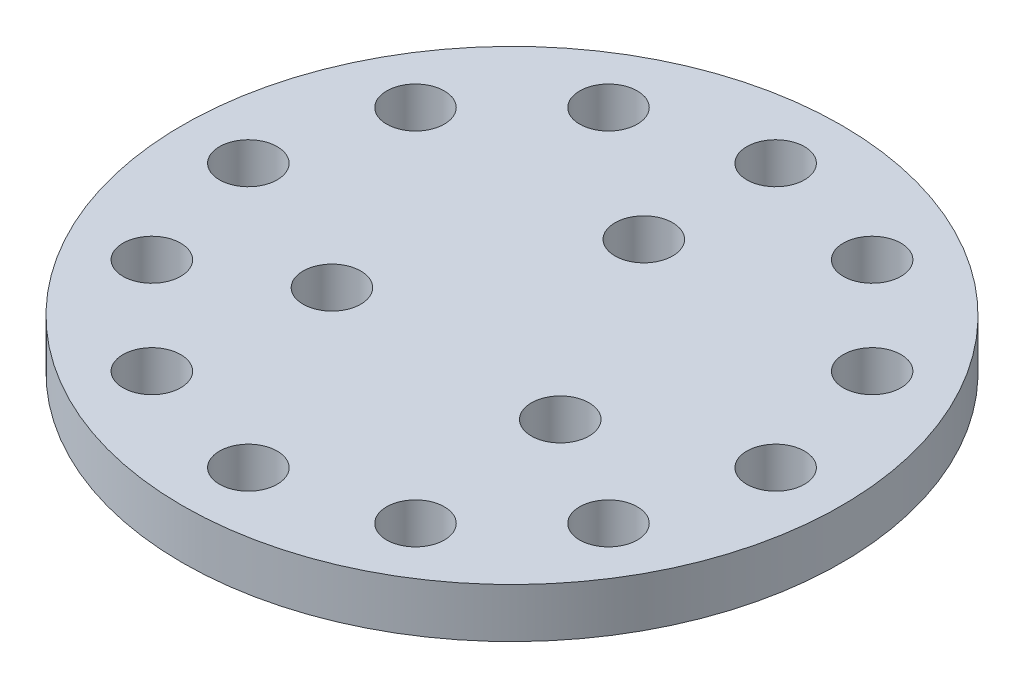
ISO-10303-21;
HEADER;
FILE_DESCRIPTION(('STEP AP214'),'2;1');
FILE_NAME('part.step','',(''),(''),'','','');
FILE_SCHEMA(('AUTOMOTIVE_DESIGN { 1 0 10303 214 1 1 1 1 }'));
ENDSEC;
DATA;
#1=APPLICATION_CONTEXT('core data for automotive mechanical design processes');
#2=APPLICATION_PROTOCOL_DEFINITION('international standard','automotive_design',2000,#1);
#3=PRODUCT_CONTEXT('',#1,'mechanical');
#4=PRODUCT('Part','Part','',(#3));
#5=PRODUCT_RELATED_PRODUCT_CATEGORY('part','',(#4));
#6=PRODUCT_DEFINITION_FORMATION('','',#4);
#7=PRODUCT_DEFINITION_CONTEXT('part definition',#1,'design');
#8=PRODUCT_DEFINITION('design','',#6,#7);
#9=PRODUCT_DEFINITION_SHAPE('','',#8);
#10=(LENGTH_UNIT() NAMED_UNIT(*) SI_UNIT(.MILLI.,.METRE.));
#11=(NAMED_UNIT(*) PLANE_ANGLE_UNIT() SI_UNIT($,.RADIAN.));
#12=(NAMED_UNIT(*) SI_UNIT($,.STERADIAN.) SOLID_ANGLE_UNIT());
#13=UNCERTAINTY_MEASURE_WITH_UNIT(LENGTH_MEASURE(1.E-05),#10,'distance_accuracy_value','');
#14=(GEOMETRIC_REPRESENTATION_CONTEXT(3) GLOBAL_UNCERTAINTY_ASSIGNED_CONTEXT((#13)) GLOBAL_UNIT_ASSIGNED_CONTEXT((#10,
#11,#12)) REPRESENTATION_CONTEXT('',''));
#15=CARTESIAN_POINT('',(0.,0.,0.));
#16=DIRECTION('',(0.,0.,1.));
#17=DIRECTION('',(1.,0.,0.));
#18=AXIS2_PLACEMENT_3D('',#15,#16,#17);
#19=CARTESIAN_POINT('',(0.,3.,0.));
#20=DIRECTION('',(0.,1.,0.));
#21=DIRECTION('',(0.,0.,1.));
#22=AXIS2_PLACEMENT_3D('',#19,#20,#21);
#23=PLANE('',#22);
#24=CARTESIAN_POINT('',(0.,3.,-16.));
#25=DIRECTION('',(0.,1.,0.));
#26=DIRECTION('',(0.,0.,1.));
#27=AXIS2_PLACEMENT_3D('',#24,#25,#26);
#28=CIRCLE('',#27,1.75);
#29=CARTESIAN_POINT('',(0.,3.,-14.25));
#30=VERTEX_POINT('',#29);
#31=EDGE_CURVE('E156',#30,#30,#28,.T.);
#32=ORIENTED_EDGE('',*,*,#31,.F.);
#33=EDGE_LOOP('',(#32));
#34=FACE_BOUND('',#33,.T.);
#35=CARTESIAN_POINT('',(13.856406460551,3.,-8.00000000000002));
#36=DIRECTION('',(0.,1.,0.));
#37=DIRECTION('',(0.,0.,1.));
#38=AXIS2_PLACEMENT_3D('',#35,#36,#37);
#39=CIRCLE('',#38,1.75);
#40=CARTESIAN_POINT('',(13.856406460551,3.,-6.25000000000002));
#41=VERTEX_POINT('',#40);
#42=EDGE_CURVE('E140',#41,#41,#39,.T.);
#43=ORIENTED_EDGE('',*,*,#42,.F.);
#44=EDGE_LOOP('',(#43));
#45=FACE_BOUND('',#44,.T.);
#46=CARTESIAN_POINT('',(13.856406460551,3.,8.00000000000002));
#47=DIRECTION('',(0.,1.,0.));
#48=DIRECTION('',(0.,0.,1.));
#49=AXIS2_PLACEMENT_3D('',#46,#47,#48);
#50=CIRCLE('',#49,1.75);
#51=CARTESIAN_POINT('',(13.856406460551,3.,9.75000000000002));
#52=VERTEX_POINT('',#51);
#53=EDGE_CURVE('E124',#52,#52,#50,.T.);
#54=ORIENTED_EDGE('',*,*,#53,.F.);
#55=EDGE_LOOP('',(#54));
#56=FACE_BOUND('',#55,.T.);
#57=CARTESIAN_POINT('',(7.99999999999997,3.,13.856406460551));
#58=DIRECTION('',(0.,1.,0.));
#59=DIRECTION('',(0.,0.,1.));
#60=AXIS2_PLACEMENT_3D('',#57,#58,#59);
#61=CIRCLE('',#60,1.75);
#62=CARTESIAN_POINT('',(7.99999999999997,3.,15.606406460551));
#63=VERTEX_POINT('',#62);
#64=EDGE_CURVE('E108',#63,#63,#61,.T.);
#65=ORIENTED_EDGE('',*,*,#64,.F.);
#66=EDGE_LOOP('',(#65));
#67=FACE_BOUND('',#66,.T.);
#68=CARTESIAN_POINT('',(-13.8564064605511,3.,7.99999999999992));
#69=DIRECTION('',(0.,1.,0.));
#70=DIRECTION('',(0.,0.,1.));
#71=AXIS2_PLACEMENT_3D('',#68,#69,#70);
#72=CIRCLE('',#71,1.75);
#73=CARTESIAN_POINT('',(-13.8564064605511,3.,9.74999999999992));
#74=VERTEX_POINT('',#73);
#75=EDGE_CURVE('E92',#74,#74,#72,.T.);
#76=ORIENTED_EDGE('',*,*,#75,.F.);
#77=EDGE_LOOP('',(#76));
#78=FACE_BOUND('',#77,.T.);
#79=CARTESIAN_POINT('',(-13.8564064605511,3.,-7.99999999999991));
#80=DIRECTION('',(0.,1.,0.));
#81=DIRECTION('',(0.,0.,1.));
#82=AXIS2_PLACEMENT_3D('',#79,#80,#81);
#83=CIRCLE('',#82,1.75);
#84=CARTESIAN_POINT('',(-13.8564064605511,3.,-6.24999999999992));
#85=VERTEX_POINT('',#84);
#86=EDGE_CURVE('E76',#85,#85,#83,.T.);
#87=ORIENTED_EDGE('',*,*,#86,.F.);
#88=EDGE_LOOP('',(#87));
#89=FACE_BOUND('',#88,.T.);
#90=CARTESIAN_POINT('',(-6.92820323027551,3.,4.));
#91=DIRECTION('',(0.,1.,0.));
#92=DIRECTION('',(0.,0.,1.));
#93=AXIS2_PLACEMENT_3D('',#90,#91,#92);
#94=CIRCLE('',#93,1.75);
#95=CARTESIAN_POINT('',(-6.92820323027551,3.,5.75));
#96=VERTEX_POINT('',#95);
#97=EDGE_CURVE('E60',#96,#96,#94,.T.);
#98=ORIENTED_EDGE('',*,*,#97,.F.);
#99=EDGE_LOOP('',(#98));
#100=FACE_BOUND('',#99,.T.);
#101=CARTESIAN_POINT('',(0.,3.,0.));
#102=DIRECTION('',(0.,1.,0.));
#103=DIRECTION('',(0.,0.,1.));
#104=AXIS2_PLACEMENT_3D('',#101,#102,#103);
#105=CIRCLE('',#104,20.);
#106=CARTESIAN_POINT('',(0.,3.,20.));
#107=VERTEX_POINT('',#106);
#108=EDGE_CURVE('E10',#107,#107,#105,.T.);
#109=ORIENTED_EDGE('',*,*,#108,.T.);
#110=EDGE_LOOP('',(#109));
#111=FACE_BOUND('',#110,.T.);
#112=CARTESIAN_POINT('',(0.,3.,-8.00000000000002));
#113=DIRECTION('',(0.,1.,0.));
#114=DIRECTION('',(0.,0.,1.));
#115=AXIS2_PLACEMENT_3D('',#112,#113,#114);
#116=CIRCLE('',#115,1.75);
#117=CARTESIAN_POINT('',(0.,3.,-6.25000000000002));
#118=VERTEX_POINT('',#117);
#119=EDGE_CURVE('E54',#118,#118,#116,.T.);
#120=ORIENTED_EDGE('',*,*,#119,.F.);
#121=EDGE_LOOP('',(#120));
#122=FACE_BOUND('',#121,.T.);
#123=CARTESIAN_POINT('',(-8.00000000000007,3.,-13.856406460551));
#124=DIRECTION('',(0.,1.,0.));
#125=DIRECTION('',(0.,0.,1.));
#126=AXIS2_PLACEMENT_3D('',#123,#124,#125);
#127=CIRCLE('',#126,1.75);
#128=CARTESIAN_POINT('',(-8.00000000000007,3.,-12.106406460551));
#129=VERTEX_POINT('',#128);
#130=EDGE_CURVE('E68',#129,#129,#127,.T.);
#131=ORIENTED_EDGE('',*,*,#130,.F.);
#132=EDGE_LOOP('',(#131));
#133=FACE_BOUND('',#132,.T.);
#134=CARTESIAN_POINT('',(-16.,3.,0.));
#135=DIRECTION('',(0.,1.,0.));
#136=DIRECTION('',(0.,0.,1.));
#137=AXIS2_PLACEMENT_3D('',#134,#135,#136);
#138=CIRCLE('',#137,1.75);
#139=CARTESIAN_POINT('',(-16.,3.,1.75));
#140=VERTEX_POINT('',#139);
#141=EDGE_CURVE('E84',#140,#140,#138,.T.);
#142=ORIENTED_EDGE('',*,*,#141,.F.);
#143=EDGE_LOOP('',(#142));
#144=FACE_BOUND('',#143,.T.);
#145=CARTESIAN_POINT('',(-8.00000000000007,3.,13.856406460551));
#146=DIRECTION('',(0.,1.,0.));
#147=DIRECTION('',(0.,0.,1.));
#148=AXIS2_PLACEMENT_3D('',#145,#146,#147);
#149=CIRCLE('',#148,1.75);
#150=CARTESIAN_POINT('',(-8.00000000000007,3.,15.606406460551));
#151=VERTEX_POINT('',#150);
#152=EDGE_CURVE('E100',#151,#151,#149,.T.);
#153=ORIENTED_EDGE('',*,*,#152,.F.);
#154=EDGE_LOOP('',(#153));
#155=FACE_BOUND('',#154,.T.);
#156=CARTESIAN_POINT('',(0.,3.,16.));
#157=DIRECTION('',(0.,1.,0.));
#158=DIRECTION('',(0.,0.,1.));
#159=AXIS2_PLACEMENT_3D('',#156,#157,#158);
#160=CIRCLE('',#159,1.75);
#161=CARTESIAN_POINT('',(0.,3.,17.75));
#162=VERTEX_POINT('',#161);
#163=EDGE_CURVE('E116',#162,#162,#160,.T.);
#164=ORIENTED_EDGE('',*,*,#163,.F.);
#165=EDGE_LOOP('',(#164));
#166=FACE_BOUND('',#165,.T.);
#167=CARTESIAN_POINT('',(16.,3.,0.));
#168=DIRECTION('',(0.,1.,0.));
#169=DIRECTION('',(0.,0.,1.));
#170=AXIS2_PLACEMENT_3D('',#167,#168,#169);
#171=CIRCLE('',#170,1.75);
#172=CARTESIAN_POINT('',(16.,3.,1.75));
#173=VERTEX_POINT('',#172);
#174=EDGE_CURVE('E132',#173,#173,#171,.T.);
#175=ORIENTED_EDGE('',*,*,#174,.F.);
#176=EDGE_LOOP('',(#175));
#177=FACE_BOUND('',#176,.T.);
#178=CARTESIAN_POINT('',(7.99999999999997,3.,-13.856406460551));
#179=DIRECTION('',(0.,1.,0.));
#180=DIRECTION('',(0.,0.,1.));
#181=AXIS2_PLACEMENT_3D('',#178,#179,#180);
#182=CIRCLE('',#181,1.75);
#183=CARTESIAN_POINT('',(7.99999999999997,3.,-12.106406460551));
#184=VERTEX_POINT('',#183);
#185=EDGE_CURVE('E148',#184,#184,#182,.T.);
#186=ORIENTED_EDGE('',*,*,#185,.F.);
#187=EDGE_LOOP('',(#186));
#188=FACE_BOUND('',#187,.T.);
#189=CARTESIAN_POINT('',(6.92820323027551,3.,4.));
#190=DIRECTION('',(0.,1.,0.));
#191=DIRECTION('',(0.,0.,1.));
#192=AXIS2_PLACEMENT_3D('',#189,#190,#191);
#193=CIRCLE('',#192,1.75);
#194=CARTESIAN_POINT('',(6.92820323027551,3.,5.75));
#195=VERTEX_POINT('',#194);
#196=EDGE_CURVE('E164',#195,#195,#193,.T.);
#197=ORIENTED_EDGE('',*,*,#196,.F.);
#198=EDGE_LOOP('',(#197));
#199=FACE_BOUND('',#198,.T.);
#200=ADVANCED_FACE('F41',(#34,#45,#56,#67,#78,#89,#100,#111,#122,#133,#144,#155,#166,#177,#188,
#199),#23,.T.);
#201=CARTESIAN_POINT('',(0.,0.,0.));
#202=DIRECTION('',(0.,1.,0.));
#203=DIRECTION('',(0.,0.,1.));
#204=AXIS2_PLACEMENT_3D('',#201,#202,#203);
#205=PLANE('',#204);
#206=CARTESIAN_POINT('',(0.,0.,0.));
#207=DIRECTION('',(0.,1.,0.));
#208=DIRECTION('',(0.,0.,1.));
#209=AXIS2_PLACEMENT_3D('',#206,#207,#208);
#210=CIRCLE('',#209,20.);
#211=CARTESIAN_POINT('',(0.,0.,20.));
#212=VERTEX_POINT('',#211);
#213=EDGE_CURVE('E45',#212,#212,#210,.T.);
#214=ORIENTED_EDGE('',*,*,#213,.F.);
#215=EDGE_LOOP('',(#214));
#216=FACE_BOUND('',#215,.T.);
#217=CARTESIAN_POINT('',(0.,0.,-8.00000000000002));
#218=DIRECTION('',(0.,1.,0.));
#219=DIRECTION('',(0.,0.,1.));
#220=AXIS2_PLACEMENT_3D('',#217,#218,#219);
#221=CIRCLE('',#220,1.75);
#222=CARTESIAN_POINT('',(0.,0.,-6.25000000000002));
#223=VERTEX_POINT('',#222);
#224=EDGE_CURVE('E56',#223,#223,#221,.T.);
#225=ORIENTED_EDGE('',*,*,#224,.T.);
#226=EDGE_LOOP('',(#225));
#227=FACE_BOUND('',#226,.T.);
#228=CARTESIAN_POINT('',(-6.92820323027551,0.,4.));
#229=DIRECTION('',(0.,1.,0.));
#230=DIRECTION('',(0.,0.,1.));
#231=AXIS2_PLACEMENT_3D('',#228,#229,#230);
#232=CIRCLE('',#231,1.75);
#233=CARTESIAN_POINT('',(-6.92820323027551,0.,5.75));
#234=VERTEX_POINT('',#233);
#235=EDGE_CURVE('E64',#234,#234,#232,.T.);
#236=ORIENTED_EDGE('',*,*,#235,.T.);
#237=EDGE_LOOP('',(#236));
#238=FACE_BOUND('',#237,.T.);
#239=CARTESIAN_POINT('',(-8.00000000000007,0.,-13.856406460551));
#240=DIRECTION('',(0.,1.,0.));
#241=DIRECTION('',(0.,0.,1.));
#242=AXIS2_PLACEMENT_3D('',#239,#240,#241);
#243=CIRCLE('',#242,1.75);
#244=CARTESIAN_POINT('',(-8.00000000000007,0.,-12.106406460551));
#245=VERTEX_POINT('',#244);
#246=EDGE_CURVE('E72',#245,#245,#243,.T.);
#247=ORIENTED_EDGE('',*,*,#246,.T.);
#248=EDGE_LOOP('',(#247));
#249=FACE_BOUND('',#248,.T.);
#250=CARTESIAN_POINT('',(-13.8564064605511,0.,-7.99999999999991));
#251=DIRECTION('',(0.,1.,0.));
#252=DIRECTION('',(0.,0.,1.));
#253=AXIS2_PLACEMENT_3D('',#250,#251,#252);
#254=CIRCLE('',#253,1.75);
#255=CARTESIAN_POINT('',(-13.8564064605511,0.,-6.24999999999992));
#256=VERTEX_POINT('',#255);
#257=EDGE_CURVE('E80',#256,#256,#254,.T.);
#258=ORIENTED_EDGE('',*,*,#257,.T.);
#259=EDGE_LOOP('',(#258));
#260=FACE_BOUND('',#259,.T.);
#261=CARTESIAN_POINT('',(-16.,0.,0.));
#262=DIRECTION('',(0.,1.,0.));
#263=DIRECTION('',(0.,0.,1.));
#264=AXIS2_PLACEMENT_3D('',#261,#262,#263);
#265=CIRCLE('',#264,1.75);
#266=CARTESIAN_POINT('',(-16.,0.,1.75));
#267=VERTEX_POINT('',#266);
#268=EDGE_CURVE('E88',#267,#267,#265,.T.);
#269=ORIENTED_EDGE('',*,*,#268,.T.);
#270=EDGE_LOOP('',(#269));
#271=FACE_BOUND('',#270,.T.);
#272=CARTESIAN_POINT('',(-13.8564064605511,0.,7.99999999999992));
#273=DIRECTION('',(0.,1.,0.));
#274=DIRECTION('',(0.,0.,1.));
#275=AXIS2_PLACEMENT_3D('',#272,#273,#274);
#276=CIRCLE('',#275,1.75);
#277=CARTESIAN_POINT('',(-13.8564064605511,0.,9.74999999999992));
#278=VERTEX_POINT('',#277);
#279=EDGE_CURVE('E96',#278,#278,#276,.T.);
#280=ORIENTED_EDGE('',*,*,#279,.T.);
#281=EDGE_LOOP('',(#280));
#282=FACE_BOUND('',#281,.T.);
#283=CARTESIAN_POINT('',(-8.00000000000007,0.,13.856406460551));
#284=DIRECTION('',(0.,1.,0.));
#285=DIRECTION('',(0.,0.,1.));
#286=AXIS2_PLACEMENT_3D('',#283,#284,#285);
#287=CIRCLE('',#286,1.75);
#288=CARTESIAN_POINT('',(-8.00000000000007,0.,15.606406460551));
#289=VERTEX_POINT('',#288);
#290=EDGE_CURVE('E104',#289,#289,#287,.T.);
#291=ORIENTED_EDGE('',*,*,#290,.T.);
#292=EDGE_LOOP('',(#291));
#293=FACE_BOUND('',#292,.T.);
#294=CARTESIAN_POINT('',(7.99999999999997,0.,13.856406460551));
#295=DIRECTION('',(0.,1.,0.));
#296=DIRECTION('',(0.,0.,1.));
#297=AXIS2_PLACEMENT_3D('',#294,#295,#296);
#298=CIRCLE('',#297,1.75);
#299=CARTESIAN_POINT('',(7.99999999999997,0.,15.606406460551));
#300=VERTEX_POINT('',#299);
#301=EDGE_CURVE('E112',#300,#300,#298,.T.);
#302=ORIENTED_EDGE('',*,*,#301,.T.);
#303=EDGE_LOOP('',(#302));
#304=FACE_BOUND('',#303,.T.);
#305=CARTESIAN_POINT('',(0.,0.,16.));
#306=DIRECTION('',(0.,1.,0.));
#307=DIRECTION('',(0.,0.,1.));
#308=AXIS2_PLACEMENT_3D('',#305,#306,#307);
#309=CIRCLE('',#308,1.75);
#310=CARTESIAN_POINT('',(0.,0.,17.75));
#311=VERTEX_POINT('',#310);
#312=EDGE_CURVE('E120',#311,#311,#309,.T.);
#313=ORIENTED_EDGE('',*,*,#312,.T.);
#314=EDGE_LOOP('',(#313));
#315=FACE_BOUND('',#314,.T.);
#316=CARTESIAN_POINT('',(13.856406460551,0.,8.00000000000002));
#317=DIRECTION('',(0.,1.,0.));
#318=DIRECTION('',(0.,0.,1.));
#319=AXIS2_PLACEMENT_3D('',#316,#317,#318);
#320=CIRCLE('',#319,1.75);
#321=CARTESIAN_POINT('',(13.856406460551,0.,9.75000000000002));
#322=VERTEX_POINT('',#321);
#323=EDGE_CURVE('E128',#322,#322,#320,.T.);
#324=ORIENTED_EDGE('',*,*,#323,.T.);
#325=EDGE_LOOP('',(#324));
#326=FACE_BOUND('',#325,.T.);
#327=CARTESIAN_POINT('',(16.,0.,0.));
#328=DIRECTION('',(0.,1.,0.));
#329=DIRECTION('',(0.,0.,1.));
#330=AXIS2_PLACEMENT_3D('',#327,#328,#329);
#331=CIRCLE('',#330,1.75);
#332=CARTESIAN_POINT('',(16.,0.,1.75));
#333=VERTEX_POINT('',#332);
#334=EDGE_CURVE('E136',#333,#333,#331,.T.);
#335=ORIENTED_EDGE('',*,*,#334,.T.);
#336=EDGE_LOOP('',(#335));
#337=FACE_BOUND('',#336,.T.);
#338=CARTESIAN_POINT('',(13.856406460551,0.,-8.00000000000002));
#339=DIRECTION('',(0.,1.,0.));
#340=DIRECTION('',(0.,0.,1.));
#341=AXIS2_PLACEMENT_3D('',#338,#339,#340);
#342=CIRCLE('',#341,1.75);
#343=CARTESIAN_POINT('',(13.856406460551,0.,-6.25000000000002));
#344=VERTEX_POINT('',#343);
#345=EDGE_CURVE('E144',#344,#344,#342,.T.);
#346=ORIENTED_EDGE('',*,*,#345,.T.);
#347=EDGE_LOOP('',(#346));
#348=FACE_BOUND('',#347,.T.);
#349=CARTESIAN_POINT('',(7.99999999999997,0.,-13.856406460551));
#350=DIRECTION('',(0.,1.,0.));
#351=DIRECTION('',(0.,0.,1.));
#352=AXIS2_PLACEMENT_3D('',#349,#350,#351);
#353=CIRCLE('',#352,1.75);
#354=CARTESIAN_POINT('',(7.99999999999997,0.,-12.106406460551));
#355=VERTEX_POINT('',#354);
#356=EDGE_CURVE('E152',#355,#355,#353,.T.);
#357=ORIENTED_EDGE('',*,*,#356,.T.);
#358=EDGE_LOOP('',(#357));
#359=FACE_BOUND('',#358,.T.);
#360=CARTESIAN_POINT('',(0.,0.,-16.));
#361=DIRECTION('',(0.,1.,0.));
#362=DIRECTION('',(0.,0.,1.));
#363=AXIS2_PLACEMENT_3D('',#360,#361,#362);
#364=CIRCLE('',#363,1.75);
#365=CARTESIAN_POINT('',(0.,0.,-14.25));
#366=VERTEX_POINT('',#365);
#367=EDGE_CURVE('E160',#366,#366,#364,.T.);
#368=ORIENTED_EDGE('',*,*,#367,.T.);
#369=EDGE_LOOP('',(#368));
#370=FACE_BOUND('',#369,.T.);
#371=CARTESIAN_POINT('',(6.92820323027551,0.,4.));
#372=DIRECTION('',(0.,1.,0.));
#373=DIRECTION('',(0.,0.,1.));
#374=AXIS2_PLACEMENT_3D('',#371,#372,#373);
#375=CIRCLE('',#374,1.75);
#376=CARTESIAN_POINT('',(6.92820323027551,0.,5.75));
#377=VERTEX_POINT('',#376);
#378=EDGE_CURVE('E168',#377,#377,#375,.T.);
#379=ORIENTED_EDGE('',*,*,#378,.T.);
#380=EDGE_LOOP('',(#379));
#381=FACE_BOUND('',#380,.T.);
#382=ADVANCED_FACE('F180',(#216,#227,#238,#249,#260,#271,#282,#293,#304,#315,#326,#337,#348,
#359,#370,#381),#205,.F.);
#383=CARTESIAN_POINT('',(0.,3.,0.));
#384=DIRECTION('',(0.,-1.,0.));
#385=DIRECTION('',(0.,0.,-1.));
#386=AXIS2_PLACEMENT_3D('',#383,#384,#385);
#387=CYLINDRICAL_SURFACE('',#386,20.);
#388=ORIENTED_EDGE('',*,*,#108,.F.);
#389=EDGE_LOOP('',(#388));
#390=FACE_BOUND('',#389,.T.);
#391=ORIENTED_EDGE('',*,*,#213,.T.);
#392=EDGE_LOOP('',(#391));
#393=FACE_BOUND('',#392,.T.);
#394=ADVANCED_FACE('F43',(#390,#393),#387,.T.);
#395=CARTESIAN_POINT('',(0.,3.,-8.00000000000002));
#396=DIRECTION('',(0.,-1.,0.));
#397=DIRECTION('',(0.,0.,-1.));
#398=AXIS2_PLACEMENT_3D('',#395,#396,#397);
#399=CYLINDRICAL_SURFACE('',#398,1.75);
#400=ORIENTED_EDGE('',*,*,#119,.T.);
#401=EDGE_LOOP('',(#400));
#402=FACE_BOUND('',#401,.T.);
#403=ORIENTED_EDGE('',*,*,#224,.F.);
#404=EDGE_LOOP('',(#403));
#405=FACE_BOUND('',#404,.T.);
#406=ADVANCED_FACE('F190',(#402,#405),#399,.F.);
#407=CARTESIAN_POINT('',(-6.92820323027551,3.,4.));
#408=DIRECTION('',(0.,-1.,0.));
#409=DIRECTION('',(0.,0.,-1.));
#410=AXIS2_PLACEMENT_3D('',#407,#408,#409);
#411=CYLINDRICAL_SURFACE('',#410,1.75);
#412=ORIENTED_EDGE('',*,*,#97,.T.);
#413=EDGE_LOOP('',(#412));
#414=FACE_BOUND('',#413,.T.);
#415=ORIENTED_EDGE('',*,*,#235,.F.);
#416=EDGE_LOOP('',(#415));
#417=FACE_BOUND('',#416,.T.);
#418=ADVANCED_FACE('F193',(#414,#417),#411,.F.);
#419=CARTESIAN_POINT('',(-8.00000000000007,3.,-13.856406460551));
#420=DIRECTION('',(0.,-1.,0.));
#421=DIRECTION('',(0.,0.,-1.));
#422=AXIS2_PLACEMENT_3D('',#419,#420,#421);
#423=CYLINDRICAL_SURFACE('',#422,1.75);
#424=ORIENTED_EDGE('',*,*,#130,.T.);
#425=EDGE_LOOP('',(#424));
#426=FACE_BOUND('',#425,.T.);
#427=ORIENTED_EDGE('',*,*,#246,.F.);
#428=EDGE_LOOP('',(#427));
#429=FACE_BOUND('',#428,.T.);
#430=ADVANCED_FACE('F197',(#426,#429),#423,.F.);
#431=CARTESIAN_POINT('',(-13.8564064605511,3.,-7.99999999999991));
#432=DIRECTION('',(0.,-1.,0.));
#433=DIRECTION('',(0.,0.,-1.));
#434=AXIS2_PLACEMENT_3D('',#431,#432,#433);
#435=CYLINDRICAL_SURFACE('',#434,1.75);
#436=ORIENTED_EDGE('',*,*,#86,.T.);
#437=EDGE_LOOP('',(#436));
#438=FACE_BOUND('',#437,.T.);
#439=ORIENTED_EDGE('',*,*,#257,.F.);
#440=EDGE_LOOP('',(#439));
#441=FACE_BOUND('',#440,.T.);
#442=ADVANCED_FACE('F201',(#438,#441),#435,.F.);
#443=CARTESIAN_POINT('',(-16.,3.,0.));
#444=DIRECTION('',(0.,-1.,0.));
#445=DIRECTION('',(0.,0.,-1.));
#446=AXIS2_PLACEMENT_3D('',#443,#444,#445);
#447=CYLINDRICAL_SURFACE('',#446,1.75);
#448=ORIENTED_EDGE('',*,*,#141,.T.);
#449=EDGE_LOOP('',(#448));
#450=FACE_BOUND('',#449,.T.);
#451=ORIENTED_EDGE('',*,*,#268,.F.);
#452=EDGE_LOOP('',(#451));
#453=FACE_BOUND('',#452,.T.);
#454=ADVANCED_FACE('F205',(#450,#453),#447,.F.);
#455=CARTESIAN_POINT('',(-13.8564064605511,3.,7.99999999999992));
#456=DIRECTION('',(0.,-1.,0.));
#457=DIRECTION('',(0.,0.,-1.));
#458=AXIS2_PLACEMENT_3D('',#455,#456,#457);
#459=CYLINDRICAL_SURFACE('',#458,1.75);
#460=ORIENTED_EDGE('',*,*,#75,.T.);
#461=EDGE_LOOP('',(#460));
#462=FACE_BOUND('',#461,.T.);
#463=ORIENTED_EDGE('',*,*,#279,.F.);
#464=EDGE_LOOP('',(#463));
#465=FACE_BOUND('',#464,.T.);
#466=ADVANCED_FACE('F209',(#462,#465),#459,.F.);
#467=CARTESIAN_POINT('',(-8.00000000000007,3.,13.856406460551));
#468=DIRECTION('',(0.,-1.,0.));
#469=DIRECTION('',(0.,0.,-1.));
#470=AXIS2_PLACEMENT_3D('',#467,#468,#469);
#471=CYLINDRICAL_SURFACE('',#470,1.75);
#472=ORIENTED_EDGE('',*,*,#152,.T.);
#473=EDGE_LOOP('',(#472));
#474=FACE_BOUND('',#473,.T.);
#475=ORIENTED_EDGE('',*,*,#290,.F.);
#476=EDGE_LOOP('',(#475));
#477=FACE_BOUND('',#476,.T.);
#478=ADVANCED_FACE('F213',(#474,#477),#471,.F.);
#479=CARTESIAN_POINT('',(7.99999999999997,3.,13.856406460551));
#480=DIRECTION('',(0.,-1.,0.));
#481=DIRECTION('',(0.,0.,-1.));
#482=AXIS2_PLACEMENT_3D('',#479,#480,#481);
#483=CYLINDRICAL_SURFACE('',#482,1.75);
#484=ORIENTED_EDGE('',*,*,#64,.T.);
#485=EDGE_LOOP('',(#484));
#486=FACE_BOUND('',#485,.T.);
#487=ORIENTED_EDGE('',*,*,#301,.F.);
#488=EDGE_LOOP('',(#487));
#489=FACE_BOUND('',#488,.T.);
#490=ADVANCED_FACE('F217',(#486,#489),#483,.F.);
#491=CARTESIAN_POINT('',(0.,3.,16.));
#492=DIRECTION('',(0.,-1.,0.));
#493=DIRECTION('',(0.,0.,-1.));
#494=AXIS2_PLACEMENT_3D('',#491,#492,#493);
#495=CYLINDRICAL_SURFACE('',#494,1.75);
#496=ORIENTED_EDGE('',*,*,#163,.T.);
#497=EDGE_LOOP('',(#496));
#498=FACE_BOUND('',#497,.T.);
#499=ORIENTED_EDGE('',*,*,#312,.F.);
#500=EDGE_LOOP('',(#499));
#501=FACE_BOUND('',#500,.T.);
#502=ADVANCED_FACE('F221',(#498,#501),#495,.F.);
#503=CARTESIAN_POINT('',(13.856406460551,3.,8.00000000000002));
#504=DIRECTION('',(0.,-1.,0.));
#505=DIRECTION('',(0.,0.,-1.));
#506=AXIS2_PLACEMENT_3D('',#503,#504,#505);
#507=CYLINDRICAL_SURFACE('',#506,1.75);
#508=ORIENTED_EDGE('',*,*,#53,.T.);
#509=EDGE_LOOP('',(#508));
#510=FACE_BOUND('',#509,.T.);
#511=ORIENTED_EDGE('',*,*,#323,.F.);
#512=EDGE_LOOP('',(#511));
#513=FACE_BOUND('',#512,.T.);
#514=ADVANCED_FACE('F225',(#510,#513),#507,.F.);
#515=CARTESIAN_POINT('',(16.,3.,0.));
#516=DIRECTION('',(0.,-1.,0.));
#517=DIRECTION('',(0.,0.,-1.));
#518=AXIS2_PLACEMENT_3D('',#515,#516,#517);
#519=CYLINDRICAL_SURFACE('',#518,1.75);
#520=ORIENTED_EDGE('',*,*,#174,.T.);
#521=EDGE_LOOP('',(#520));
#522=FACE_BOUND('',#521,.T.);
#523=ORIENTED_EDGE('',*,*,#334,.F.);
#524=EDGE_LOOP('',(#523));
#525=FACE_BOUND('',#524,.T.);
#526=ADVANCED_FACE('F229',(#522,#525),#519,.F.);
#527=CARTESIAN_POINT('',(13.856406460551,3.,-8.00000000000002));
#528=DIRECTION('',(0.,-1.,0.));
#529=DIRECTION('',(0.,0.,-1.));
#530=AXIS2_PLACEMENT_3D('',#527,#528,#529);
#531=CYLINDRICAL_SURFACE('',#530,1.75);
#532=ORIENTED_EDGE('',*,*,#42,.T.);
#533=EDGE_LOOP('',(#532));
#534=FACE_BOUND('',#533,.T.);
#535=ORIENTED_EDGE('',*,*,#345,.F.);
#536=EDGE_LOOP('',(#535));
#537=FACE_BOUND('',#536,.T.);
#538=ADVANCED_FACE('F233',(#534,#537),#531,.F.);
#539=CARTESIAN_POINT('',(7.99999999999997,3.,-13.856406460551));
#540=DIRECTION('',(0.,-1.,0.));
#541=DIRECTION('',(0.,0.,-1.));
#542=AXIS2_PLACEMENT_3D('',#539,#540,#541);
#543=CYLINDRICAL_SURFACE('',#542,1.75);
#544=ORIENTED_EDGE('',*,*,#185,.T.);
#545=EDGE_LOOP('',(#544));
#546=FACE_BOUND('',#545,.T.);
#547=ORIENTED_EDGE('',*,*,#356,.F.);
#548=EDGE_LOOP('',(#547));
#549=FACE_BOUND('',#548,.T.);
#550=ADVANCED_FACE('F237',(#546,#549),#543,.F.);
#551=CARTESIAN_POINT('',(0.,3.,-16.));
#552=DIRECTION('',(0.,-1.,0.));
#553=DIRECTION('',(0.,0.,-1.));
#554=AXIS2_PLACEMENT_3D('',#551,#552,#553);
#555=CYLINDRICAL_SURFACE('',#554,1.75);
#556=ORIENTED_EDGE('',*,*,#31,.T.);
#557=EDGE_LOOP('',(#556));
#558=FACE_BOUND('',#557,.T.);
#559=ORIENTED_EDGE('',*,*,#367,.F.);
#560=EDGE_LOOP('',(#559));
#561=FACE_BOUND('',#560,.T.);
#562=ADVANCED_FACE('F241',(#558,#561),#555,.F.);
#563=CARTESIAN_POINT('',(6.92820323027551,3.,4.));
#564=DIRECTION('',(0.,-1.,0.));
#565=DIRECTION('',(0.,0.,-1.));
#566=AXIS2_PLACEMENT_3D('',#563,#564,#565);
#567=CYLINDRICAL_SURFACE('',#566,1.75);
#568=ORIENTED_EDGE('',*,*,#196,.T.);
#569=EDGE_LOOP('',(#568));
#570=FACE_BOUND('',#569,.T.);
#571=ORIENTED_EDGE('',*,*,#378,.F.);
#572=EDGE_LOOP('',(#571));
#573=FACE_BOUND('',#572,.T.);
#574=ADVANCED_FACE('F176',(#570,#573),#567,.F.);
#575=CLOSED_SHELL('',(#200,#382,#394,#406,#418,#430,#442,#454,#466,#478,#490,#502,#514,#526,
#538,#550,#562,#574));
#576=MANIFOLD_SOLID_BREP('B2',#575);
#577=ADVANCED_BREP_SHAPE_REPRESENTATION('',(#18,#576),#14);
#578=SHAPE_DEFINITION_REPRESENTATION(#9,#577);
ENDSEC;
END-ISO-10303-21;
